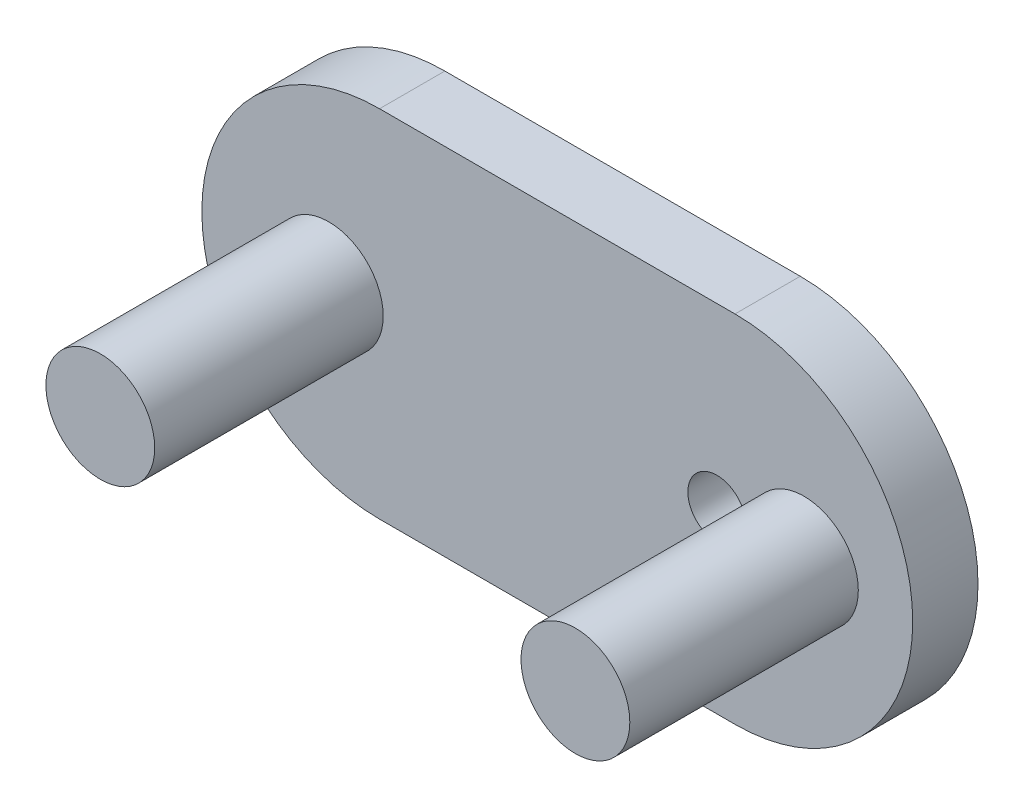
ISO-10303-21;
HEADER;
FILE_DESCRIPTION(('STEP AP214'),'2;1');
FILE_NAME('part.step','',(''),(''),'','','');
FILE_SCHEMA(('AUTOMOTIVE_DESIGN { 1 0 10303 214 1 1 1 1 }'));
ENDSEC;
DATA;
#1=APPLICATION_CONTEXT('core data for automotive mechanical design processes');
#2=APPLICATION_PROTOCOL_DEFINITION('international standard','automotive_design',2000,#1);
#3=PRODUCT_CONTEXT('',#1,'mechanical');
#4=PRODUCT('Part','Part','',(#3));
#5=PRODUCT_RELATED_PRODUCT_CATEGORY('part','',(#4));
#6=PRODUCT_DEFINITION_FORMATION('','',#4);
#7=PRODUCT_DEFINITION_CONTEXT('part definition',#1,'design');
#8=PRODUCT_DEFINITION('design','',#6,#7);
#9=PRODUCT_DEFINITION_SHAPE('','',#8);
#10=(LENGTH_UNIT() NAMED_UNIT(*) SI_UNIT(.MILLI.,.METRE.));
#11=(NAMED_UNIT(*) PLANE_ANGLE_UNIT() SI_UNIT($,.RADIAN.));
#12=(NAMED_UNIT(*) SI_UNIT($,.STERADIAN.) SOLID_ANGLE_UNIT());
#13=UNCERTAINTY_MEASURE_WITH_UNIT(LENGTH_MEASURE(1.E-05),#10,'distance_accuracy_value','');
#14=(GEOMETRIC_REPRESENTATION_CONTEXT(3) GLOBAL_UNCERTAINTY_ASSIGNED_CONTEXT((#13)) GLOBAL_UNIT_ASSIGNED_CONTEXT((#10,
#11,#12)) REPRESENTATION_CONTEXT('',''));
#15=CARTESIAN_POINT('',(0.,0.,0.));
#16=DIRECTION('',(0.,0.,1.));
#17=DIRECTION('',(1.,0.,0.));
#18=AXIS2_PLACEMENT_3D('',#15,#16,#17);
#19=CARTESIAN_POINT('',(-4.9,0.,1.8));
#20=DIRECTION('',(0.,0.,1.));
#21=DIRECTION('',(1.,0.,0.));
#22=AXIS2_PLACEMENT_3D('',#19,#20,#21);
#23=PLANE('',#22);
#24=CARTESIAN_POINT('',(6.8,0.,1.8));
#25=DIRECTION('',(0.,0.,1.));
#26=DIRECTION('',(1.,0.,0.));
#27=AXIS2_PLACEMENT_3D('',#24,#25,#26);
#28=CIRCLE('',#27,1.5);
#29=CARTESIAN_POINT('',(8.3,0.,1.8));
#30=VERTEX_POINT('',#29);
#31=EDGE_CURVE('E129',#30,#30,#28,.T.);
#32=ORIENTED_EDGE('',*,*,#31,.F.);
#33=EDGE_LOOP('',(#32));
#34=FACE_BOUND('',#33,.T.);
#35=CARTESIAN_POINT('',(-6.3,0.,1.8));
#36=DIRECTION('',(0.,0.,1.));
#37=DIRECTION('',(1.,0.,0.));
#38=AXIS2_PLACEMENT_3D('',#35,#36,#37);
#39=CIRCLE('',#38,1.5);
#40=CARTESIAN_POINT('',(-4.8,0.,1.8));
#41=VERTEX_POINT('',#40);
#42=EDGE_CURVE('E121',#41,#41,#39,.T.);
#43=ORIENTED_EDGE('',*,*,#42,.F.);
#44=EDGE_LOOP('',(#43));
#45=FACE_BOUND('',#44,.T.);
#46=CARTESIAN_POINT('',(-4.9,0.,1.8));
#47=DIRECTION('',(0.,0.,1.));
#48=DIRECTION('',(1.,0.,0.));
#49=AXIS2_PLACEMENT_3D('',#46,#47,#48);
#50=CIRCLE('',#49,4.9);
#51=CARTESIAN_POINT('',(-4.9,4.9,1.8));
#52=VERTEX_POINT('',#51);
#53=CARTESIAN_POINT('',(-4.9,-4.9,1.8));
#54=VERTEX_POINT('',#53);
#55=EDGE_CURVE('E88',#52,#54,#50,.T.);
#56=ORIENTED_EDGE('',*,*,#55,.T.);
#57=DIRECTION('',(1.,0.,0.));
#58=VECTOR('',#57,1.);
#59=CARTESIAN_POINT('',(4.9,-4.9,1.8));
#60=LINE('',#59,#58);
#61=CARTESIAN_POINT('',(4.9,-4.9,1.8));
#62=VERTEX_POINT('',#61);
#63=EDGE_CURVE('E83',#54,#62,#60,.T.);
#64=ORIENTED_EDGE('',*,*,#63,.T.);
#65=CARTESIAN_POINT('',(4.9,0.,1.8));
#66=DIRECTION('',(0.,0.,1.));
#67=DIRECTION('',(1.,0.,0.));
#68=AXIS2_PLACEMENT_3D('',#65,#66,#67);
#69=CIRCLE('',#68,4.9);
#70=CARTESIAN_POINT('',(4.9,4.9,1.8));
#71=VERTEX_POINT('',#70);
#72=EDGE_CURVE('E86',#62,#71,#69,.T.);
#73=ORIENTED_EDGE('',*,*,#72,.T.);
#74=DIRECTION('',(-1.,0.,0.));
#75=VECTOR('',#74,1.);
#76=CARTESIAN_POINT('',(-4.9,4.9,1.8));
#77=LINE('',#76,#75);
#78=EDGE_CURVE('E53',#71,#52,#77,.T.);
#79=ORIENTED_EDGE('',*,*,#78,.T.);
#80=EDGE_LOOP('',(#56,#64,#73,#79));
#81=FACE_BOUND('',#80,.T.);
#82=CARTESIAN_POINT('',(4.4,0.,1.8));
#83=DIRECTION('',(0.,0.,1.));
#84=DIRECTION('',(1.,0.,0.));
#85=AXIS2_PLACEMENT_3D('',#82,#83,#84);
#86=CIRCLE('',#85,0.800000000000001);
#87=CARTESIAN_POINT('',(5.2,0.,1.8));
#88=VERTEX_POINT('',#87);
#89=EDGE_CURVE('E103',#88,#88,#86,.T.);
#90=ORIENTED_EDGE('',*,*,#89,.F.);
#91=EDGE_LOOP('',(#90));
#92=FACE_BOUND('',#91,.T.);
#93=ADVANCED_FACE('F36',(#34,#45,#81,#92),#23,.T.);
#94=CARTESIAN_POINT('',(-4.9,0.,0.));
#95=DIRECTION('',(0.,0.,1.));
#96=DIRECTION('',(1.,0.,0.));
#97=AXIS2_PLACEMENT_3D('',#94,#95,#96);
#98=PLANE('',#97);
#99=CARTESIAN_POINT('',(-4.9,0.,0.));
#100=DIRECTION('',(0.,0.,1.));
#101=DIRECTION('',(1.,0.,0.));
#102=AXIS2_PLACEMENT_3D('',#99,#100,#101);
#103=CIRCLE('',#102,4.9);
#104=CARTESIAN_POINT('',(-4.9,4.9,0.));
#105=VERTEX_POINT('',#104);
#106=CARTESIAN_POINT('',(-4.9,-4.9,0.));
#107=VERTEX_POINT('',#106);
#108=EDGE_CURVE('E100',#105,#107,#103,.T.);
#109=ORIENTED_EDGE('',*,*,#108,.F.);
#110=DIRECTION('',(-1.,0.,0.));
#111=VECTOR('',#110,1.);
#112=CARTESIAN_POINT('',(-4.9,4.9,0.));
#113=LINE('',#112,#111);
#114=CARTESIAN_POINT('',(4.9,4.9,0.));
#115=VERTEX_POINT('',#114);
#116=EDGE_CURVE('E76',#115,#105,#113,.T.);
#117=ORIENTED_EDGE('',*,*,#116,.F.);
#118=CARTESIAN_POINT('',(4.9,0.,0.));
#119=DIRECTION('',(0.,0.,1.));
#120=DIRECTION('',(1.,0.,0.));
#121=AXIS2_PLACEMENT_3D('',#118,#119,#120);
#122=CIRCLE('',#121,4.9);
#123=CARTESIAN_POINT('',(4.9,-4.9,0.));
#124=VERTEX_POINT('',#123);
#125=EDGE_CURVE('E70',#124,#115,#122,.T.);
#126=ORIENTED_EDGE('',*,*,#125,.F.);
#127=DIRECTION('',(1.,0.,0.));
#128=VECTOR('',#127,1.);
#129=CARTESIAN_POINT('',(4.9,-4.9,0.));
#130=LINE('',#129,#128);
#131=EDGE_CURVE('E92',#107,#124,#130,.T.);
#132=ORIENTED_EDGE('',*,*,#131,.F.);
#133=EDGE_LOOP('',(#109,#117,#126,#132));
#134=FACE_BOUND('',#133,.T.);
#135=CARTESIAN_POINT('',(4.4,0.,0.));
#136=DIRECTION('',(0.,0.,1.));
#137=DIRECTION('',(1.,0.,0.));
#138=AXIS2_PLACEMENT_3D('',#135,#136,#137);
#139=CIRCLE('',#138,0.800000000000001);
#140=CARTESIAN_POINT('',(5.2,0.,0.));
#141=VERTEX_POINT('',#140);
#142=EDGE_CURVE('E115',#141,#141,#139,.T.);
#143=ORIENTED_EDGE('',*,*,#142,.T.);
#144=EDGE_LOOP('',(#143));
#145=FACE_BOUND('',#144,.T.);
#146=ADVANCED_FACE('F111',(#134,#145),#98,.F.);
#147=CARTESIAN_POINT('',(-4.9,0.,1.8));
#148=DIRECTION('',(0.,0.,-1.));
#149=DIRECTION('',(-1.,0.,0.));
#150=AXIS2_PLACEMENT_3D('',#147,#148,#149);
#151=CYLINDRICAL_SURFACE('',#150,4.9);
#152=ORIENTED_EDGE('',*,*,#108,.T.);
#153=DIRECTION('',(0.,0.,-1.));
#154=VECTOR('',#153,1.);
#155=CARTESIAN_POINT('',(-4.9,-4.9,1.8));
#156=LINE('',#155,#154);
#157=EDGE_CURVE('E11',#54,#107,#156,.T.);
#158=ORIENTED_EDGE('',*,*,#157,.F.);
#159=ORIENTED_EDGE('',*,*,#55,.F.);
#160=DIRECTION('',(0.,0.,-1.));
#161=VECTOR('',#160,1.);
#162=CARTESIAN_POINT('',(-4.9,4.9,1.8));
#163=LINE('',#162,#161);
#164=EDGE_CURVE('E96',#52,#105,#163,.T.);
#165=ORIENTED_EDGE('',*,*,#164,.T.);
#166=EDGE_LOOP('',(#152,#158,#159,#165));
#167=FACE_BOUND('',#166,.T.);
#168=ADVANCED_FACE('F38',(#167),#151,.T.);
#169=CARTESIAN_POINT('',(4.9,-4.9,1.8));
#170=DIRECTION('',(0.,1.,0.));
#171=DIRECTION('',(0.,0.,1.));
#172=AXIS2_PLACEMENT_3D('',#169,#170,#171);
#173=PLANE('',#172);
#174=ORIENTED_EDGE('',*,*,#131,.T.);
#175=DIRECTION('',(0.,0.,-1.));
#176=VECTOR('',#175,1.);
#177=CARTESIAN_POINT('',(4.9,-4.9,1.8));
#178=LINE('',#177,#176);
#179=EDGE_CURVE('E45',#62,#124,#178,.T.);
#180=ORIENTED_EDGE('',*,*,#179,.F.);
#181=ORIENTED_EDGE('',*,*,#63,.F.);
#182=ORIENTED_EDGE('',*,*,#157,.T.);
#183=EDGE_LOOP('',(#174,#180,#181,#182));
#184=FACE_BOUND('',#183,.T.);
#185=ADVANCED_FACE('F91',(#184),#173,.F.);
#186=CARTESIAN_POINT('',(4.9,0.,1.8));
#187=DIRECTION('',(0.,0.,-1.));
#188=DIRECTION('',(-1.,0.,0.));
#189=AXIS2_PLACEMENT_3D('',#186,#187,#188);
#190=CYLINDRICAL_SURFACE('',#189,4.9);
#191=ORIENTED_EDGE('',*,*,#125,.T.);
#192=DIRECTION('',(0.,0.,-1.));
#193=VECTOR('',#192,1.);
#194=CARTESIAN_POINT('',(4.9,4.9,1.8));
#195=LINE('',#194,#193);
#196=EDGE_CURVE('E93',#71,#115,#195,.T.);
#197=ORIENTED_EDGE('',*,*,#196,.F.);
#198=ORIENTED_EDGE('',*,*,#72,.F.);
#199=ORIENTED_EDGE('',*,*,#179,.T.);
#200=EDGE_LOOP('',(#191,#197,#198,#199));
#201=FACE_BOUND('',#200,.T.);
#202=ADVANCED_FACE('F94',(#201),#190,.T.);
#203=CARTESIAN_POINT('',(-4.9,4.9,1.8));
#204=DIRECTION('',(0.,-1.,0.));
#205=DIRECTION('',(0.,0.,-1.));
#206=AXIS2_PLACEMENT_3D('',#203,#204,#205);
#207=PLANE('',#206);
#208=ORIENTED_EDGE('',*,*,#116,.T.);
#209=ORIENTED_EDGE('',*,*,#164,.F.);
#210=ORIENTED_EDGE('',*,*,#78,.F.);
#211=ORIENTED_EDGE('',*,*,#196,.T.);
#212=EDGE_LOOP('',(#208,#209,#210,#211));
#213=FACE_BOUND('',#212,.T.);
#214=ADVANCED_FACE('F108',(#213),#207,.F.);
#215=CARTESIAN_POINT('',(4.4,0.,1.8));
#216=DIRECTION('',(0.,0.,-1.));
#217=DIRECTION('',(-1.,0.,0.));
#218=AXIS2_PLACEMENT_3D('',#215,#216,#217);
#219=CYLINDRICAL_SURFACE('',#218,0.800000000000001);
#220=ORIENTED_EDGE('',*,*,#89,.T.);
#221=EDGE_LOOP('',(#220));
#222=FACE_BOUND('',#221,.T.);
#223=ORIENTED_EDGE('',*,*,#142,.F.);
#224=EDGE_LOOP('',(#223));
#225=FACE_BOUND('',#224,.T.);
#226=ADVANCED_FACE('F144',(#222,#225),#219,.F.);
#227=CARTESIAN_POINT('',(-6.3,0.,8.1));
#228=DIRECTION('',(0.,0.,-1.));
#229=DIRECTION('',(-1.,0.,0.));
#230=AXIS2_PLACEMENT_3D('',#227,#228,#229);
#231=CYLINDRICAL_SURFACE('',#230,1.5);
#232=CARTESIAN_POINT('',(-6.3,0.,8.1));
#233=DIRECTION('',(0.,0.,1.));
#234=DIRECTION('',(1.,0.,0.));
#235=AXIS2_PLACEMENT_3D('',#232,#233,#234);
#236=CIRCLE('',#235,1.5);
#237=CARTESIAN_POINT('',(-4.8,0.,8.1));
#238=VERTEX_POINT('',#237);
#239=EDGE_CURVE('E118',#238,#238,#236,.T.);
#240=ORIENTED_EDGE('',*,*,#239,.F.);
#241=EDGE_LOOP('',(#240));
#242=FACE_BOUND('',#241,.T.);
#243=ORIENTED_EDGE('',*,*,#42,.T.);
#244=EDGE_LOOP('',(#243));
#245=FACE_BOUND('',#244,.T.);
#246=ADVANCED_FACE('F141',(#242,#245),#231,.T.);
#247=CARTESIAN_POINT('',(-6.3,0.,8.1));
#248=DIRECTION('',(0.,0.,1.));
#249=DIRECTION('',(1.,0.,0.));
#250=AXIS2_PLACEMENT_3D('',#247,#248,#249);
#251=PLANE('',#250);
#252=ORIENTED_EDGE('',*,*,#239,.T.);
#253=EDGE_LOOP('',(#252));
#254=FACE_BOUND('',#253,.T.);
#255=ADVANCED_FACE('F143',(#254),#251,.T.);
#256=CARTESIAN_POINT('',(6.8,0.,12.3426406871193));
#257=DIRECTION('',(0.,0.,-1.));
#258=DIRECTION('',(-1.,0.,0.));
#259=AXIS2_PLACEMENT_3D('',#256,#257,#258);
#260=CYLINDRICAL_SURFACE('',#259,1.5);
#261=ORIENTED_EDGE('',*,*,#31,.T.);
#262=EDGE_LOOP('',(#261));
#263=FACE_BOUND('',#262,.T.);
#264=CARTESIAN_POINT('',(6.8,0.,8.1));
#265=DIRECTION('',(0.,0.,1.));
#266=DIRECTION('',(1.,0.,0.));
#267=AXIS2_PLACEMENT_3D('',#264,#265,#266);
#268=CIRCLE('',#267,1.5);
#269=CARTESIAN_POINT('',(8.3,0.,8.1));
#270=VERTEX_POINT('',#269);
#271=EDGE_CURVE('E124',#270,#270,#268,.T.);
#272=ORIENTED_EDGE('',*,*,#271,.F.);
#273=EDGE_LOOP('',(#272));
#274=FACE_BOUND('',#273,.T.);
#275=ADVANCED_FACE('F133',(#263,#274),#260,.T.);
#276=CARTESIAN_POINT('',(-6.3,0.,8.1));
#277=DIRECTION('',(0.,0.,1.));
#278=DIRECTION('',(1.,0.,0.));
#279=AXIS2_PLACEMENT_3D('',#276,#277,#278);
#280=PLANE('',#279);
#281=ORIENTED_EDGE('',*,*,#271,.T.);
#282=EDGE_LOOP('',(#281));
#283=FACE_BOUND('',#282,.T.);
#284=ADVANCED_FACE('F189',(#283),#280,.T.);
#285=CLOSED_SHELL('',(#93,#146,#168,#185,#202,#214,#226,#246,#255,#275,#284));
#286=MANIFOLD_SOLID_BREP('B2',#285);
#287=ADVANCED_BREP_SHAPE_REPRESENTATION('',(#18,#286),#14);
#288=SHAPE_DEFINITION_REPRESENTATION(#9,#287);
ENDSEC;
END-ISO-10303-21;
